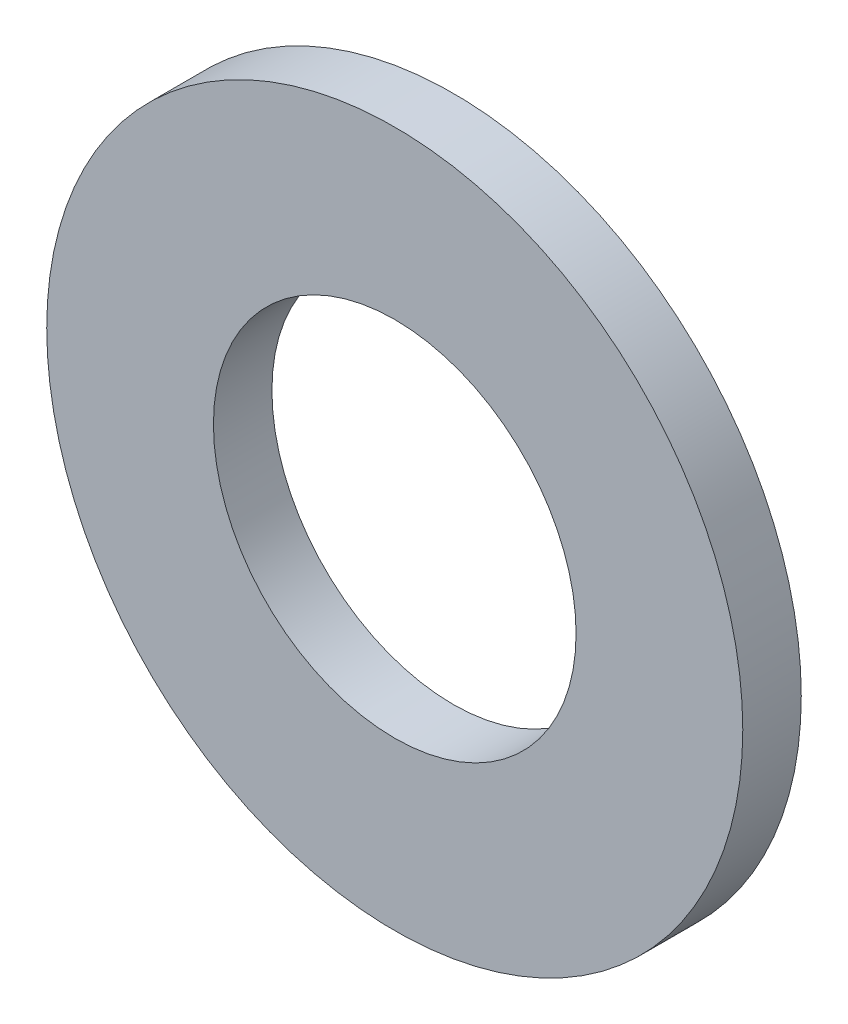
ISO-10303-21;
HEADER;
FILE_DESCRIPTION(('STEP AP214'),'2;1');
FILE_NAME('part.step','',(''),(''),'','','');
FILE_SCHEMA(('AUTOMOTIVE_DESIGN { 1 0 10303 214 1 1 1 1 }'));
ENDSEC;
DATA;
#1=APPLICATION_CONTEXT('core data for automotive mechanical design processes');
#2=APPLICATION_PROTOCOL_DEFINITION('international standard','automotive_design',2000,#1);
#3=PRODUCT_CONTEXT('',#1,'mechanical');
#4=PRODUCT('Part','Part','',(#3));
#5=PRODUCT_RELATED_PRODUCT_CATEGORY('part','',(#4));
#6=PRODUCT_DEFINITION_FORMATION('','',#4);
#7=PRODUCT_DEFINITION_CONTEXT('part definition',#1,'design');
#8=PRODUCT_DEFINITION('design','',#6,#7);
#9=PRODUCT_DEFINITION_SHAPE('','',#8);
#10=(LENGTH_UNIT() NAMED_UNIT(*) SI_UNIT(.MILLI.,.METRE.));
#11=(NAMED_UNIT(*) PLANE_ANGLE_UNIT() SI_UNIT($,.RADIAN.));
#12=(NAMED_UNIT(*) SI_UNIT($,.STERADIAN.) SOLID_ANGLE_UNIT());
#13=UNCERTAINTY_MEASURE_WITH_UNIT(LENGTH_MEASURE(1.E-05),#10,'distance_accuracy_value','');
#14=(GEOMETRIC_REPRESENTATION_CONTEXT(3) GLOBAL_UNCERTAINTY_ASSIGNED_CONTEXT((#13)) GLOBAL_UNIT_ASSIGNED_CONTEXT((#10,
#11,#12)) REPRESENTATION_CONTEXT('',''));
#15=CARTESIAN_POINT('',(0.,0.,0.));
#16=DIRECTION('',(0.,0.,1.));
#17=DIRECTION('',(1.,0.,0.));
#18=AXIS2_PLACEMENT_3D('',#15,#16,#17);
#19=CARTESIAN_POINT('',(0.,0.,1.));
#20=DIRECTION('',(0.,0.,1.));
#21=DIRECTION('',(1.,0.,0.));
#22=AXIS2_PLACEMENT_3D('',#19,#20,#21);
#23=PLANE('',#22);
#24=CARTESIAN_POINT('',(0.,0.,1.));
#25=DIRECTION('',(0.,0.,1.));
#26=DIRECTION('',(1.,0.,0.));
#27=AXIS2_PLACEMENT_3D('',#24,#25,#26);
#28=CIRCLE('',#27,5.95);
#29=CARTESIAN_POINT('',(5.95,0.,1.));
#30=VERTEX_POINT('',#29);
#31=EDGE_CURVE('E10',#30,#30,#28,.T.);
#32=ORIENTED_EDGE('',*,*,#31,.T.);
#33=EDGE_LOOP('',(#32));
#34=FACE_BOUND('',#33,.T.);
#35=CARTESIAN_POINT('',(0.,0.,1.));
#36=DIRECTION('',(0.,0.,1.));
#37=DIRECTION('',(1.,0.,0.));
#38=AXIS2_PLACEMENT_3D('',#35,#36,#37);
#39=CIRCLE('',#38,3.1);
#40=CARTESIAN_POINT('',(3.1,0.,1.));
#41=VERTEX_POINT('',#40);
#42=EDGE_CURVE('E39',#41,#41,#39,.T.);
#43=ORIENTED_EDGE('',*,*,#42,.F.);
#44=EDGE_LOOP('',(#43));
#45=FACE_BOUND('',#44,.T.);
#46=ADVANCED_FACE('F28',(#34,#45),#23,.T.);
#47=CARTESIAN_POINT('',(0.,0.,0.));
#48=DIRECTION('',(0.,0.,1.));
#49=DIRECTION('',(1.,0.,0.));
#50=AXIS2_PLACEMENT_3D('',#47,#48,#49);
#51=PLANE('',#50);
#52=CARTESIAN_POINT('',(0.,0.,0.));
#53=DIRECTION('',(0.,0.,1.));
#54=DIRECTION('',(1.,0.,0.));
#55=AXIS2_PLACEMENT_3D('',#52,#53,#54);
#56=CIRCLE('',#55,5.95);
#57=CARTESIAN_POINT('',(5.95,0.,0.));
#58=VERTEX_POINT('',#57);
#59=EDGE_CURVE('E32',#58,#58,#56,.T.);
#60=ORIENTED_EDGE('',*,*,#59,.F.);
#61=EDGE_LOOP('',(#60));
#62=FACE_BOUND('',#61,.T.);
#63=CARTESIAN_POINT('',(0.,0.,0.));
#64=DIRECTION('',(0.,0.,1.));
#65=DIRECTION('',(1.,0.,0.));
#66=AXIS2_PLACEMENT_3D('',#63,#64,#65);
#67=CIRCLE('',#66,3.1);
#68=CARTESIAN_POINT('',(3.1,0.,0.));
#69=VERTEX_POINT('',#68);
#70=EDGE_CURVE('E41',#69,#69,#67,.T.);
#71=ORIENTED_EDGE('',*,*,#70,.T.);
#72=EDGE_LOOP('',(#71));
#73=FACE_BOUND('',#72,.T.);
#74=ADVANCED_FACE('F51',(#62,#73),#51,.F.);
#75=CARTESIAN_POINT('',(0.,0.,1.));
#76=DIRECTION('',(0.,0.,-1.));
#77=DIRECTION('',(-1.,0.,0.));
#78=AXIS2_PLACEMENT_3D('',#75,#76,#77);
#79=CYLINDRICAL_SURFACE('',#78,5.95);
#80=ORIENTED_EDGE('',*,*,#31,.F.);
#81=EDGE_LOOP('',(#80));
#82=FACE_BOUND('',#81,.T.);
#83=ORIENTED_EDGE('',*,*,#59,.T.);
#84=EDGE_LOOP('',(#83));
#85=FACE_BOUND('',#84,.T.);
#86=ADVANCED_FACE('F30',(#82,#85),#79,.T.);
#87=CARTESIAN_POINT('',(0.,0.,1.));
#88=DIRECTION('',(0.,0.,-1.));
#89=DIRECTION('',(-1.,0.,0.));
#90=AXIS2_PLACEMENT_3D('',#87,#88,#89);
#91=CYLINDRICAL_SURFACE('',#90,3.1);
#92=ORIENTED_EDGE('',*,*,#42,.T.);
#93=EDGE_LOOP('',(#92));
#94=FACE_BOUND('',#93,.T.);
#95=ORIENTED_EDGE('',*,*,#70,.F.);
#96=EDGE_LOOP('',(#95));
#97=FACE_BOUND('',#96,.T.);
#98=ADVANCED_FACE('F47',(#94,#97),#91,.F.);
#99=CLOSED_SHELL('',(#46,#74,#86,#98));
#100=MANIFOLD_SOLID_BREP('B2',#99);
#101=ADVANCED_BREP_SHAPE_REPRESENTATION('',(#18,#100),#14);
#102=SHAPE_DEFINITION_REPRESENTATION(#9,#101);
ENDSEC;
END-ISO-10303-21;
